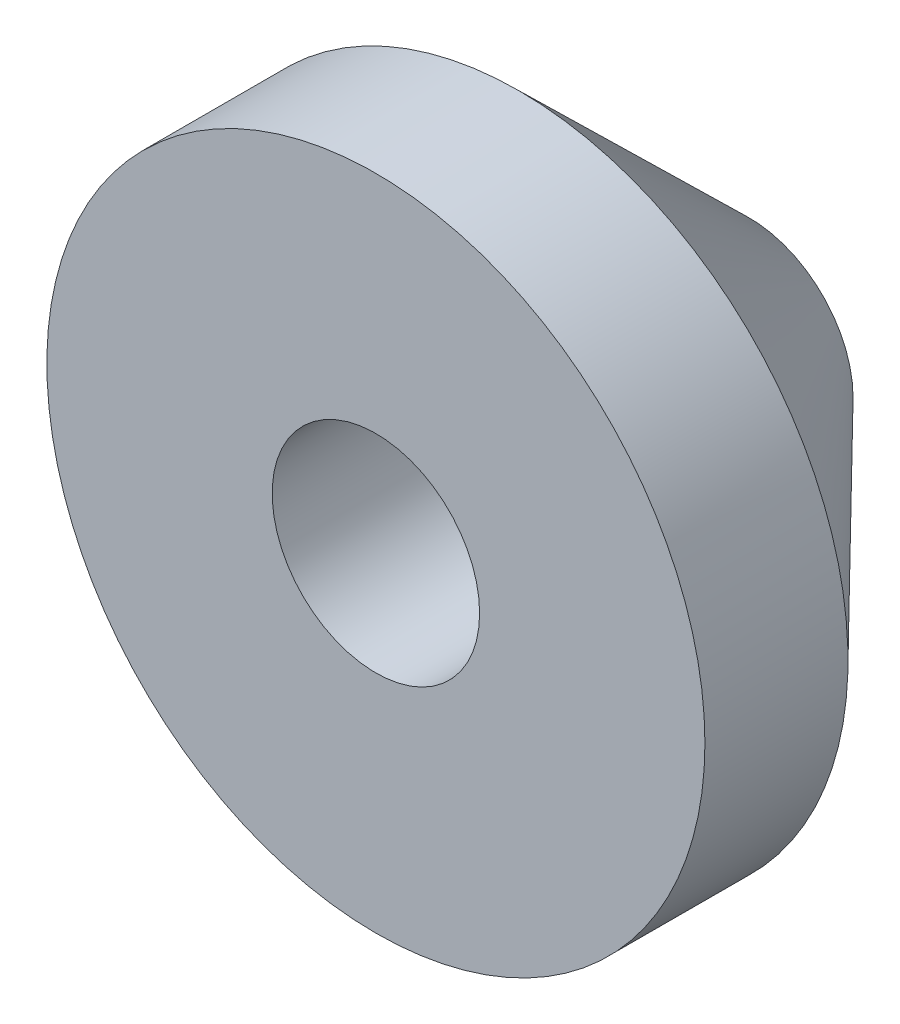
ISO-10303-21;
HEADER;
FILE_DESCRIPTION(('STEP AP214'),'2;1');
FILE_NAME('part.step','',(''),(''),'','','');
FILE_SCHEMA(('AUTOMOTIVE_DESIGN { 1 0 10303 214 1 1 1 1 }'));
ENDSEC;
DATA;
#1=APPLICATION_CONTEXT('core data for automotive mechanical design processes');
#2=APPLICATION_PROTOCOL_DEFINITION('international standard','automotive_design',2000,#1);
#3=PRODUCT_CONTEXT('',#1,'mechanical');
#4=PRODUCT('Part','Part','',(#3));
#5=PRODUCT_RELATED_PRODUCT_CATEGORY('part','',(#4));
#6=PRODUCT_DEFINITION_FORMATION('','',#4);
#7=PRODUCT_DEFINITION_CONTEXT('part definition',#1,'design');
#8=PRODUCT_DEFINITION('design','',#6,#7);
#9=PRODUCT_DEFINITION_SHAPE('','',#8);
#10=(LENGTH_UNIT() NAMED_UNIT(*) SI_UNIT(.MILLI.,.METRE.));
#11=(NAMED_UNIT(*) PLANE_ANGLE_UNIT() SI_UNIT($,.RADIAN.));
#12=(NAMED_UNIT(*) SI_UNIT($,.STERADIAN.) SOLID_ANGLE_UNIT());
#13=UNCERTAINTY_MEASURE_WITH_UNIT(LENGTH_MEASURE(1.E-05),#10,'distance_accuracy_value','');
#14=(GEOMETRIC_REPRESENTATION_CONTEXT(3) GLOBAL_UNCERTAINTY_ASSIGNED_CONTEXT((#13)) GLOBAL_UNIT_ASSIGNED_CONTEXT((#10,
#11,#12)) REPRESENTATION_CONTEXT('',''));
#15=CARTESIAN_POINT('',(0.,0.,0.));
#16=DIRECTION('',(0.,0.,1.));
#17=DIRECTION('',(1.,0.,0.));
#18=AXIS2_PLACEMENT_3D('',#15,#16,#17);
#19=CARTESIAN_POINT('',(0.,0.,5.));
#20=DIRECTION('',(0.,0.,-1.));
#21=DIRECTION('',(-1.,0.,0.));
#22=AXIS2_PLACEMENT_3D('',#19,#20,#21);
#23=CYLINDRICAL_SURFACE('',#22,11.5);
#24=CARTESIAN_POINT('',(0.,0.,5.));
#25=DIRECTION('',(0.,0.,1.));
#26=DIRECTION('',(1.,0.,0.));
#27=AXIS2_PLACEMENT_3D('',#24,#25,#26);
#28=CIRCLE('',#27,11.5);
#29=CARTESIAN_POINT('',(11.5,0.,5.));
#30=VERTEX_POINT('',#29);
#31=EDGE_CURVE('E10',#30,#30,#28,.T.);
#32=ORIENTED_EDGE('',*,*,#31,.F.);
#33=EDGE_LOOP('',(#32));
#34=FACE_BOUND('',#33,.T.);
#35=CARTESIAN_POINT('',(0.,0.,0.));
#36=DIRECTION('',(0.,0.,1.));
#37=DIRECTION('',(0.,-1.,0.));
#38=AXIS2_PLACEMENT_3D('',#35,#36,#37);
#39=CIRCLE('',#38,11.5);
#40=CARTESIAN_POINT('',(0.,-11.5,0.));
#41=VERTEX_POINT('',#40);
#42=EDGE_CURVE('E40',#41,#41,#39,.T.);
#43=ORIENTED_EDGE('',*,*,#42,.T.);
#44=EDGE_LOOP('',(#43));
#45=FACE_BOUND('',#44,.T.);
#46=ADVANCED_FACE('F33',(#34,#45),#23,.T.);
#47=CARTESIAN_POINT('',(0.,0.,5.));
#48=DIRECTION('',(0.,0.,1.));
#49=DIRECTION('',(1.,0.,0.));
#50=AXIS2_PLACEMENT_3D('',#47,#48,#49);
#51=PLANE('',#50);
#52=CARTESIAN_POINT('',(0.,0.,5.));
#53=DIRECTION('',(0.,0.,1.));
#54=DIRECTION('',(1.,0.,0.));
#55=AXIS2_PLACEMENT_3D('',#52,#53,#54);
#56=CIRCLE('',#55,3.625);
#57=CARTESIAN_POINT('',(3.625,0.,5.));
#58=VERTEX_POINT('',#57);
#59=EDGE_CURVE('E46',#58,#58,#56,.T.);
#60=ORIENTED_EDGE('',*,*,#59,.F.);
#61=EDGE_LOOP('',(#60));
#62=FACE_BOUND('',#61,.T.);
#63=ORIENTED_EDGE('',*,*,#31,.T.);
#64=EDGE_LOOP('',(#63));
#65=FACE_BOUND('',#64,.T.);
#66=ADVANCED_FACE('F62',(#62,#65),#51,.T.);
#67=CARTESIAN_POINT('',(0.,0.,-11.7578155471077));
#68=DIRECTION('',(0.,0.,1.));
#69=DIRECTION('',(0.,-1.,0.));
#70=AXIS2_PLACEMENT_3D('',#67,#68,#69);
#71=CONICAL_SURFACE('',#70,0.,0.77431350296321);
#72=CARTESIAN_POINT('',(0.,0.,-8.05154760291072));
#73=DIRECTION('',(0.,0.,1.));
#74=DIRECTION('',(0.,-1.,0.));
#75=AXIS2_PLACEMENT_3D('',#72,#73,#74);
#76=CIRCLE('',#75,3.625);
#77=CARTESIAN_POINT('',(0.,-3.625,-8.05154760291072));
#78=VERTEX_POINT('',#77);
#79=EDGE_CURVE('E36',#78,#78,#76,.T.);
#80=CARTESIAN_POINT('',(0.,-3.625,-8.05154760291072));
#81=CARTESIAN_POINT('',(0.,-3.70703125,-7.9676773153804));
#82=CARTESIAN_POINT('',(0.,-3.7890625,-7.88380702785008));
#83=CARTESIAN_POINT('',(0.,-3.953125,-7.71606645278944));
#84=CARTESIAN_POINT('',(0.,-4.03515625,-7.63219616525912));
#85=CARTESIAN_POINT('',(0.,-4.19921875,-7.46445559019848));
#86=CARTESIAN_POINT('',(0.,-4.28125,-7.38058530266816));
#87=CARTESIAN_POINT('',(0.,-4.4453125,-7.21284472760752));
#88=CARTESIAN_POINT('',(0.,-4.52734375,-7.1289744400772));
#89=CARTESIAN_POINT('',(0.,-4.69140625,-6.96123386501656));
#90=CARTESIAN_POINT('',(0.,-4.7734375,-6.87736357748624));
#91=CARTESIAN_POINT('',(0.,-4.9375,-6.7096230024256));
#92=CARTESIAN_POINT('',(0.,-5.01953125,-6.62575271489528));
#93=CARTESIAN_POINT('',(0.,-5.18359375,-6.45801213983464));
#94=CARTESIAN_POINT('',(0.,-5.265625,-6.37414185230432));
#95=CARTESIAN_POINT('',(0.,-5.4296875,-6.20640127724368));
#96=CARTESIAN_POINT('',(0.,-5.51171875,-6.12253098971336));
#97=CARTESIAN_POINT('',(0.,-5.67578125,-5.95479041465272));
#98=CARTESIAN_POINT('',(0.,-5.7578125,-5.8709201271224));
#99=CARTESIAN_POINT('',(0.,-5.921875,-5.70317955206176));
#100=CARTESIAN_POINT('',(0.,-6.00390625,-5.61930926453144));
#101=CARTESIAN_POINT('',(0.,-6.16796875,-5.4515686894708));
#102=CARTESIAN_POINT('',(0.,-6.25,-5.36769840194048));
#103=CARTESIAN_POINT('',(0.,-6.4140625,-5.19995782687984));
#104=CARTESIAN_POINT('',(0.,-6.49609375,-5.11608753934952));
#105=CARTESIAN_POINT('',(0.,-6.66015625,-4.94834696428888));
#106=CARTESIAN_POINT('',(0.,-6.7421875,-4.86447667675856));
#107=CARTESIAN_POINT('',(0.,-6.90625,-4.69673610169792));
#108=CARTESIAN_POINT('',(0.,-6.98828125,-4.6128658141676));
#109=CARTESIAN_POINT('',(0.,-7.15234375,-4.44512523910696));
#110=CARTESIAN_POINT('',(0.,-7.234375,-4.36125495157664));
#111=CARTESIAN_POINT('',(0.,-7.3984375,-4.193514376516));
#112=CARTESIAN_POINT('',(0.,-7.48046875,-4.10964408898568));
#113=CARTESIAN_POINT('',(0.,-7.64453125,-3.94190351392504));
#114=CARTESIAN_POINT('',(0.,-7.7265625,-3.85803322639472));
#115=CARTESIAN_POINT('',(0.,-7.890625,-3.69029265133408));
#116=CARTESIAN_POINT('',(0.,-7.97265625,-3.60642236380376));
#117=CARTESIAN_POINT('',(0.,-8.13671875,-3.43868178874312));
#118=CARTESIAN_POINT('',(0.,-8.21875,-3.3548115012128));
#119=CARTESIAN_POINT('',(0.,-8.3828125,-3.18707092615216));
#120=CARTESIAN_POINT('',(0.,-8.46484375,-3.10320063862184));
#121=CARTESIAN_POINT('',(0.,-8.62890625,-2.9354600635612));
#122=CARTESIAN_POINT('',(0.,-8.7109375,-2.85158977603088));
#123=CARTESIAN_POINT('',(0.,-8.875,-2.68384920097024));
#124=CARTESIAN_POINT('',(0.,-8.95703125,-2.59997891343992));
#125=CARTESIAN_POINT('',(0.,-9.12109375,-2.43223833837928));
#126=CARTESIAN_POINT('',(0.,-9.20312500000001,-2.34836805084896));
#127=CARTESIAN_POINT('',(0.,-9.3671875,-2.18062747578832));
#128=CARTESIAN_POINT('',(0.,-9.44921875,-2.096757188258));
#129=CARTESIAN_POINT('',(0.,-9.61328125,-1.92901661319736));
#130=CARTESIAN_POINT('',(0.,-9.6953125,-1.84514632566704));
#131=CARTESIAN_POINT('',(0.,-9.859375,-1.6774057506064));
#132=CARTESIAN_POINT('',(0.,-9.94140625,-1.59353546307608));
#133=CARTESIAN_POINT('',(0.,-10.10546875,-1.42579488801544));
#134=CARTESIAN_POINT('',(0.,-10.1875,-1.34192460048512));
#135=CARTESIAN_POINT('',(0.,-10.3515625,-1.17418402542448));
#136=CARTESIAN_POINT('',(0.,-10.43359375,-1.09031373789416));
#137=CARTESIAN_POINT('',(0.,-10.59765625,-0.922573162833517));
#138=CARTESIAN_POINT('',(0.,-10.6796875,-0.838702875303198));
#139=CARTESIAN_POINT('',(0.,-10.84375,-0.670962300242558));
#140=CARTESIAN_POINT('',(0.,-10.92578125,-0.587092012712238));
#141=CARTESIAN_POINT('',(0.,-11.08984375,-0.419351437651598));
#142=CARTESIAN_POINT('',(0.,-11.171875,-0.335481150121278));
#143=CARTESIAN_POINT('',(0.,-11.3359375,-0.167740575060638));
#144=CARTESIAN_POINT('',(0.,-11.41796875,-0.0838702875303178));
#145=CARTESIAN_POINT('',(0.,-11.5,0.));
#146=B_SPLINE_CURVE_WITH_KNOTS('',3,(#80,#81,#82,#83,#84,#85,#86,#87,#88,#89,#90,#91,#92,#93,
#94,#95,#96,#97,#98,#99,#100,#101,#102,#103,#104,#105,#106,#107,#108,#109,#110,#111,#112,#113,
#114,#115,#116,#117,#118,#119,#120,#121,#122,#123,#124,#125,#126,#127,#128,#129,#130,#131,#132,
#133,#134,#135,#136,#137,#138,#139,#140,#141,#142,#143,#144,#145),.UNSPECIFIED.,.F.,.F.,(4,2,2,
2,2,2,2,2,2,2,2,2,2,2,2,2,2,2,2,2,2,2,2,2,2,2,2,2,2,2,2,2,4),(0.,0.351951928482895,
0.703903856965792,1.05585578544869,1.40780771393158,1.75975964241448,2.11171157089737,
2.46366349938027,2.81561542786317,3.16756735634606,3.51951928482896,3.87147121331186,
4.22342314179475,4.57537507027765,4.92732699876054,5.27927892724344,5.63123085572633,
5.98318278420923,6.33513471269212,6.68708664117502,7.03903856965792,7.39099049814081,
7.74294242662371,8.09489435510661,8.4468462835895,8.7987982120724,9.15075014055529,
9.50270206903819,9.85465399752108,10.206605926004,10.5585578544869,10.9105097829698,
11.2624617114527),.UNSPECIFIED.);
#147=EDGE_CURVE('BSEAM53',#78,#41,#146,.T.);
#148=ORIENTED_EDGE('',*,*,#79,.T.);
#149=ORIENTED_EDGE('',*,*,#42,.F.);
#150=ORIENTED_EDGE('',*,*,#147,.T.);
#151=ORIENTED_EDGE('',*,*,#147,.F.);
#152=EDGE_LOOP('',(#148,#150,#149,#151));
#153=FACE_BOUND('',#152,.T.);
#154=ADVANCED_FACE('F53',(#153),#71,.T.);
#155=CARTESIAN_POINT('',(0.,0.,-11.7578155471077));
#156=DIRECTION('',(0.,0.,1.));
#157=DIRECTION('',(1.,0.,0.));
#158=AXIS2_PLACEMENT_3D('',#155,#156,#157);
#159=CYLINDRICAL_SURFACE('',#158,3.625);
#160=ORIENTED_EDGE('',*,*,#59,.T.);
#161=EDGE_LOOP('',(#160));
#162=FACE_BOUND('',#161,.T.);
#163=ORIENTED_EDGE('',*,*,#79,.F.);
#164=EDGE_LOOP('',(#163));
#165=FACE_BOUND('',#164,.T.);
#166=ADVANCED_FACE('F56',(#162,#165),#159,.F.);
#167=CLOSED_SHELL('',(#46,#66,#154,#166));
#168=MANIFOLD_SOLID_BREP('B2',#167);
#169=ADVANCED_BREP_SHAPE_REPRESENTATION('',(#18,#168),#14);
#170=SHAPE_DEFINITION_REPRESENTATION(#9,#169);
ENDSEC;
END-ISO-10303-21;
